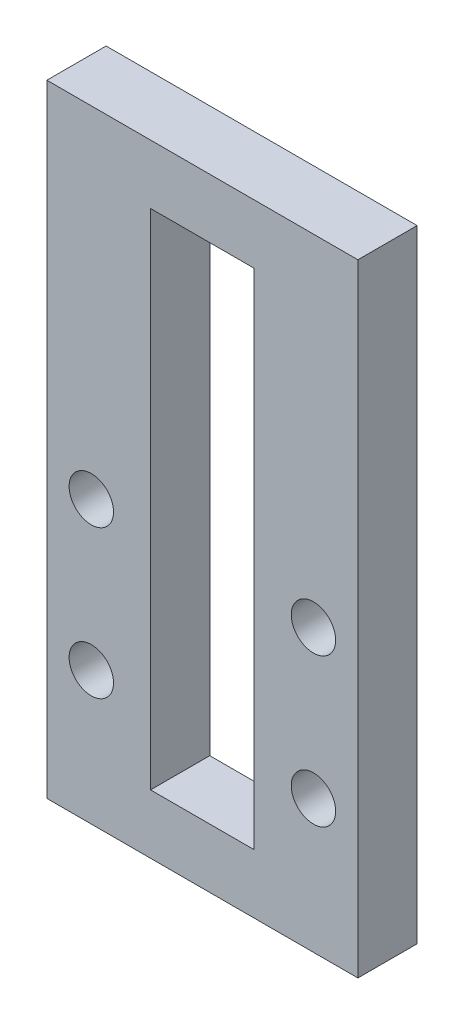
ISO-10303-21;
HEADER;
FILE_DESCRIPTION(('STEP AP214'),'2;1');
FILE_NAME('part.step','',(''),(''),'','','');
FILE_SCHEMA(('AUTOMOTIVE_DESIGN { 1 0 10303 214 1 1 1 1 }'));
ENDSEC;
DATA;
#1=APPLICATION_CONTEXT('core data for automotive mechanical design processes');
#2=APPLICATION_PROTOCOL_DEFINITION('international standard','automotive_design',2000,#1);
#3=PRODUCT_CONTEXT('',#1,'mechanical');
#4=PRODUCT('Part','Part','',(#3));
#5=PRODUCT_RELATED_PRODUCT_CATEGORY('part','',(#4));
#6=PRODUCT_DEFINITION_FORMATION('','',#4);
#7=PRODUCT_DEFINITION_CONTEXT('part definition',#1,'design');
#8=PRODUCT_DEFINITION('design','',#6,#7);
#9=PRODUCT_DEFINITION_SHAPE('','',#8);
#10=(LENGTH_UNIT() NAMED_UNIT(*) SI_UNIT(.MILLI.,.METRE.));
#11=(NAMED_UNIT(*) PLANE_ANGLE_UNIT() SI_UNIT($,.RADIAN.));
#12=(NAMED_UNIT(*) SI_UNIT($,.STERADIAN.) SOLID_ANGLE_UNIT());
#13=UNCERTAINTY_MEASURE_WITH_UNIT(LENGTH_MEASURE(1.E-05),#10,'distance_accuracy_value','');
#14=(GEOMETRIC_REPRESENTATION_CONTEXT(3) GLOBAL_UNCERTAINTY_ASSIGNED_CONTEXT((#13)) GLOBAL_UNIT_ASSIGNED_CONTEXT((#10,
#11,#12)) REPRESENTATION_CONTEXT('',''));
#15=CARTESIAN_POINT('',(0.,0.,0.));
#16=DIRECTION('',(0.,0.,1.));
#17=DIRECTION('',(1.,0.,0.));
#18=AXIS2_PLACEMENT_3D('',#15,#16,#17);
#19=CARTESIAN_POINT('',(0.,0.,4.));
#20=DIRECTION('',(0.,0.,1.));
#21=DIRECTION('',(1.,0.,0.));
#22=AXIS2_PLACEMENT_3D('',#19,#20,#21);
#23=PLANE('',#22);
#24=DIRECTION('',(0.,-1.,0.));
#25=VECTOR('',#24,1.);
#26=CARTESIAN_POINT('',(-3.5,24.,4.));
#27=LINE('',#26,#25);
#28=CARTESIAN_POINT('',(-3.5,24.,4.));
#29=VERTEX_POINT('',#28);
#30=CARTESIAN_POINT('',(-3.5,-10.,4.));
#31=VERTEX_POINT('',#30);
#32=EDGE_CURVE('E51',#29,#31,#27,.T.);
#33=ORIENTED_EDGE('',*,*,#32,.F.);
#34=DIRECTION('',(-1.,0.,0.));
#35=VECTOR('',#34,1.);
#36=CARTESIAN_POINT('',(-3.5,24.,4.));
#37=LINE('',#36,#35);
#38=CARTESIAN_POINT('',(3.5,24.,4.));
#39=VERTEX_POINT('',#38);
#40=EDGE_CURVE('E119',#39,#29,#37,.T.);
#41=ORIENTED_EDGE('',*,*,#40,.F.);
#42=DIRECTION('',(0.,1.,0.));
#43=VECTOR('',#42,1.);
#44=CARTESIAN_POINT('',(3.5,24.,4.));
#45=LINE('',#44,#43);
#46=CARTESIAN_POINT('',(3.5,-10.,4.));
#47=VERTEX_POINT('',#46);
#48=EDGE_CURVE('E122',#47,#39,#45,.T.);
#49=ORIENTED_EDGE('',*,*,#48,.F.);
#50=DIRECTION('',(1.,0.,0.));
#51=VECTOR('',#50,1.);
#52=CARTESIAN_POINT('',(-3.5,-10.,4.));
#53=LINE('',#52,#51);
#54=EDGE_CURVE('E128',#31,#47,#53,.T.);
#55=ORIENTED_EDGE('',*,*,#54,.F.);
#56=EDGE_LOOP('',(#33,#41,#49,#55));
#57=FACE_BOUND('',#56,.T.);
#58=DIRECTION('',(0.,1.,0.));
#59=VECTOR('',#58,1.);
#60=CARTESIAN_POINT('',(10.5,-14.,4.));
#61=LINE('',#60,#59);
#62=CARTESIAN_POINT('',(10.5,-14.,4.));
#63=VERTEX_POINT('',#62);
#64=CARTESIAN_POINT('',(10.5,28.,4.));
#65=VERTEX_POINT('',#64);
#66=EDGE_CURVE('E181',#63,#65,#61,.T.);
#67=ORIENTED_EDGE('',*,*,#66,.T.);
#68=DIRECTION('',(-1.,0.,0.));
#69=VECTOR('',#68,1.);
#70=CARTESIAN_POINT('',(-10.5,28.,4.));
#71=LINE('',#70,#69);
#72=CARTESIAN_POINT('',(-10.5,28.,4.));
#73=VERTEX_POINT('',#72);
#74=EDGE_CURVE('E134',#65,#73,#71,.T.);
#75=ORIENTED_EDGE('',*,*,#74,.T.);
#76=DIRECTION('',(0.,-1.,0.));
#77=VECTOR('',#76,1.);
#78=CARTESIAN_POINT('',(-10.5,14.,4.));
#79=LINE('',#78,#77);
#80=CARTESIAN_POINT('',(-10.5,-14.,4.));
#81=VERTEX_POINT('',#80);
#82=EDGE_CURVE('E175',#73,#81,#79,.T.);
#83=ORIENTED_EDGE('',*,*,#82,.T.);
#84=DIRECTION('',(1.,0.,0.));
#85=VECTOR('',#84,1.);
#86=CARTESIAN_POINT('',(-10.5,-14.,4.));
#87=LINE('',#86,#85);
#88=EDGE_CURVE('E178',#81,#63,#87,.T.);
#89=ORIENTED_EDGE('',*,*,#88,.T.);
#90=EDGE_LOOP('',(#67,#75,#83,#89));
#91=FACE_BOUND('',#90,.T.);
#92=CARTESIAN_POINT('',(-7.5,-5.,4.));
#93=DIRECTION('',(0.,0.,1.));
#94=DIRECTION('',(1.,0.,0.));
#95=AXIS2_PLACEMENT_3D('',#92,#93,#94);
#96=CIRCLE('',#95,1.5);
#97=CARTESIAN_POINT('',(-6.,-5.,4.));
#98=VERTEX_POINT('',#97);
#99=EDGE_CURVE('E157',#98,#98,#96,.T.);
#100=ORIENTED_EDGE('',*,*,#99,.F.);
#101=EDGE_LOOP('',(#100));
#102=FACE_BOUND('',#101,.T.);
#103=CARTESIAN_POINT('',(-7.5,5.,4.));
#104=DIRECTION('',(0.,0.,1.));
#105=DIRECTION('',(1.,0.,0.));
#106=AXIS2_PLACEMENT_3D('',#103,#104,#105);
#107=CIRCLE('',#106,1.5);
#108=CARTESIAN_POINT('',(-6.,5.,4.));
#109=VERTEX_POINT('',#108);
#110=EDGE_CURVE('E169',#109,#109,#107,.T.);
#111=ORIENTED_EDGE('',*,*,#110,.F.);
#112=EDGE_LOOP('',(#111));
#113=FACE_BOUND('',#112,.T.);
#114=CARTESIAN_POINT('',(7.5,5.,4.));
#115=DIRECTION('',(0.,0.,1.));
#116=DIRECTION('',(1.,0.,0.));
#117=AXIS2_PLACEMENT_3D('',#114,#115,#116);
#118=CIRCLE('',#117,1.5);
#119=CARTESIAN_POINT('',(9.,5.,4.));
#120=VERTEX_POINT('',#119);
#121=EDGE_CURVE('E163',#120,#120,#118,.T.);
#122=ORIENTED_EDGE('',*,*,#121,.F.);
#123=EDGE_LOOP('',(#122));
#124=FACE_BOUND('',#123,.T.);
#125=CARTESIAN_POINT('',(7.5,-5.,4.));
#126=DIRECTION('',(0.,0.,1.));
#127=DIRECTION('',(1.,0.,0.));
#128=AXIS2_PLACEMENT_3D('',#125,#126,#127);
#129=CIRCLE('',#128,1.5);
#130=CARTESIAN_POINT('',(9.,-5.,4.));
#131=VERTEX_POINT('',#130);
#132=EDGE_CURVE('E151',#131,#131,#129,.T.);
#133=ORIENTED_EDGE('',*,*,#132,.F.);
#134=EDGE_LOOP('',(#133));
#135=FACE_BOUND('',#134,.T.);
#136=ADVANCED_FACE('F36',(#57,#91,#102,#113,#124,#135),#23,.T.);
#137=CARTESIAN_POINT('',(0.,0.,0.));
#138=DIRECTION('',(0.,0.,1.));
#139=DIRECTION('',(1.,0.,0.));
#140=AXIS2_PLACEMENT_3D('',#137,#138,#139);
#141=PLANE('',#140);
#142=DIRECTION('',(-1.,0.,0.));
#143=VECTOR('',#142,1.);
#144=CARTESIAN_POINT('',(-3.5,24.,0.));
#145=LINE('',#144,#143);
#146=CARTESIAN_POINT('',(3.5,24.,0.));
#147=VERTEX_POINT('',#146);
#148=CARTESIAN_POINT('',(-3.5,24.,0.));
#149=VERTEX_POINT('',#148);
#150=EDGE_CURVE('E109',#147,#149,#145,.T.);
#151=ORIENTED_EDGE('',*,*,#150,.T.);
#152=DIRECTION('',(0.,-1.,0.));
#153=VECTOR('',#152,1.);
#154=CARTESIAN_POINT('',(-3.5,24.,0.));
#155=LINE('',#154,#153);
#156=CARTESIAN_POINT('',(-3.5,-10.,0.));
#157=VERTEX_POINT('',#156);
#158=EDGE_CURVE('E103',#149,#157,#155,.T.);
#159=ORIENTED_EDGE('',*,*,#158,.T.);
#160=DIRECTION('',(1.,0.,0.));
#161=VECTOR('',#160,1.);
#162=CARTESIAN_POINT('',(-3.5,-10.,0.));
#163=LINE('',#162,#161);
#164=CARTESIAN_POINT('',(3.5,-10.,0.));
#165=VERTEX_POINT('',#164);
#166=EDGE_CURVE('E112',#157,#165,#163,.T.);
#167=ORIENTED_EDGE('',*,*,#166,.T.);
#168=DIRECTION('',(0.,1.,0.));
#169=VECTOR('',#168,1.);
#170=CARTESIAN_POINT('',(3.5,24.,0.));
#171=LINE('',#170,#169);
#172=EDGE_CURVE('E59',#165,#147,#171,.T.);
#173=ORIENTED_EDGE('',*,*,#172,.T.);
#174=EDGE_LOOP('',(#151,#159,#167,#173));
#175=FACE_BOUND('',#174,.T.);
#176=DIRECTION('',(0.,-1.,0.));
#177=VECTOR('',#176,1.);
#178=CARTESIAN_POINT('',(-10.5,14.,0.));
#179=LINE('',#178,#177);
#180=CARTESIAN_POINT('',(-10.5,28.,0.));
#181=VERTEX_POINT('',#180);
#182=CARTESIAN_POINT('',(-10.5,-14.,0.));
#183=VERTEX_POINT('',#182);
#184=EDGE_CURVE('E172',#181,#183,#179,.T.);
#185=ORIENTED_EDGE('',*,*,#184,.F.);
#186=DIRECTION('',(1.,0.,0.));
#187=VECTOR('',#186,1.);
#188=CARTESIAN_POINT('',(-10.5,28.,0.));
#189=LINE('',#188,#187);
#190=CARTESIAN_POINT('',(10.5,28.,0.));
#191=VERTEX_POINT('',#190);
#192=EDGE_CURVE('E138',#181,#191,#189,.T.);
#193=ORIENTED_EDGE('',*,*,#192,.T.);
#194=DIRECTION('',(0.,1.,0.));
#195=VECTOR('',#194,1.);
#196=CARTESIAN_POINT('',(10.5,-14.,0.));
#197=LINE('',#196,#195);
#198=CARTESIAN_POINT('',(10.5,-14.,0.));
#199=VERTEX_POINT('',#198);
#200=EDGE_CURVE('E179',#199,#191,#197,.T.);
#201=ORIENTED_EDGE('',*,*,#200,.F.);
#202=DIRECTION('',(1.,0.,0.));
#203=VECTOR('',#202,1.);
#204=CARTESIAN_POINT('',(-10.5,-14.,0.));
#205=LINE('',#204,#203);
#206=EDGE_CURVE('E185',#183,#199,#205,.T.);
#207=ORIENTED_EDGE('',*,*,#206,.F.);
#208=EDGE_LOOP('',(#185,#193,#201,#207));
#209=FACE_BOUND('',#208,.T.);
#210=CARTESIAN_POINT('',(-7.5,5.,0.));
#211=DIRECTION('',(0.,0.,1.));
#212=DIRECTION('',(1.,0.,0.));
#213=AXIS2_PLACEMENT_3D('',#210,#211,#212);
#214=CIRCLE('',#213,1.5);
#215=CARTESIAN_POINT('',(-6.,5.,0.));
#216=VERTEX_POINT('',#215);
#217=EDGE_CURVE('E166',#216,#216,#214,.T.);
#218=ORIENTED_EDGE('',*,*,#217,.T.);
#219=EDGE_LOOP('',(#218));
#220=FACE_BOUND('',#219,.T.);
#221=CARTESIAN_POINT('',(7.5,5.,0.));
#222=DIRECTION('',(0.,0.,1.));
#223=DIRECTION('',(1.,0.,0.));
#224=AXIS2_PLACEMENT_3D('',#221,#222,#223);
#225=CIRCLE('',#224,1.5);
#226=CARTESIAN_POINT('',(9.,5.,0.));
#227=VERTEX_POINT('',#226);
#228=EDGE_CURVE('E160',#227,#227,#225,.T.);
#229=ORIENTED_EDGE('',*,*,#228,.T.);
#230=EDGE_LOOP('',(#229));
#231=FACE_BOUND('',#230,.T.);
#232=CARTESIAN_POINT('',(-7.5,-5.,0.));
#233=DIRECTION('',(0.,0.,1.));
#234=DIRECTION('',(1.,0.,0.));
#235=AXIS2_PLACEMENT_3D('',#232,#233,#234);
#236=CIRCLE('',#235,1.5);
#237=CARTESIAN_POINT('',(-6.,-5.,0.));
#238=VERTEX_POINT('',#237);
#239=EDGE_CURVE('E154',#238,#238,#236,.T.);
#240=ORIENTED_EDGE('',*,*,#239,.T.);
#241=EDGE_LOOP('',(#240));
#242=FACE_BOUND('',#241,.T.);
#243=CARTESIAN_POINT('',(7.5,-5.,0.));
#244=DIRECTION('',(0.,0.,1.));
#245=DIRECTION('',(1.,0.,0.));
#246=AXIS2_PLACEMENT_3D('',#243,#244,#245);
#247=CIRCLE('',#246,1.5);
#248=CARTESIAN_POINT('',(9.,-5.,0.));
#249=VERTEX_POINT('',#248);
#250=EDGE_CURVE('E141',#249,#249,#247,.T.);
#251=ORIENTED_EDGE('',*,*,#250,.T.);
#252=EDGE_LOOP('',(#251));
#253=FACE_BOUND('',#252,.T.);
#254=ADVANCED_FACE('F116',(#175,#209,#220,#231,#242,#253),#141,.F.);
#255=CARTESIAN_POINT('',(-10.5,14.,4.));
#256=DIRECTION('',(1.,0.,0.));
#257=DIRECTION('',(0.,0.,-1.));
#258=AXIS2_PLACEMENT_3D('',#255,#256,#257);
#259=PLANE('',#258);
#260=ORIENTED_EDGE('',*,*,#184,.T.);
#261=DIRECTION('',(0.,0.,-1.));
#262=VECTOR('',#261,1.);
#263=CARTESIAN_POINT('',(-10.5,-14.,4.));
#264=LINE('',#263,#262);
#265=EDGE_CURVE('E11',#81,#183,#264,.T.);
#266=ORIENTED_EDGE('',*,*,#265,.F.);
#267=ORIENTED_EDGE('',*,*,#82,.F.);
#268=DIRECTION('',(0.,0.,1.));
#269=VECTOR('',#268,1.);
#270=CARTESIAN_POINT('',(-10.5,28.,-25.2388589282479));
#271=LINE('',#270,#269);
#272=EDGE_CURVE('E142',#181,#73,#271,.T.);
#273=ORIENTED_EDGE('',*,*,#272,.F.);
#274=EDGE_LOOP('',(#260,#266,#267,#273));
#275=FACE_BOUND('',#274,.T.);
#276=ADVANCED_FACE('F38',(#275),#259,.F.);
#277=CARTESIAN_POINT('',(-10.5,-14.,4.));
#278=DIRECTION('',(0.,1.,0.));
#279=DIRECTION('',(0.,0.,1.));
#280=AXIS2_PLACEMENT_3D('',#277,#278,#279);
#281=PLANE('',#280);
#282=ORIENTED_EDGE('',*,*,#206,.T.);
#283=DIRECTION('',(0.,0.,-1.));
#284=VECTOR('',#283,1.);
#285=CARTESIAN_POINT('',(10.5,-14.,4.));
#286=LINE('',#285,#284);
#287=EDGE_CURVE('E44',#63,#199,#286,.T.);
#288=ORIENTED_EDGE('',*,*,#287,.F.);
#289=ORIENTED_EDGE('',*,*,#88,.F.);
#290=ORIENTED_EDGE('',*,*,#265,.T.);
#291=EDGE_LOOP('',(#282,#288,#289,#290));
#292=FACE_BOUND('',#291,.T.);
#293=ADVANCED_FACE('F204',(#292),#281,.F.);
#294=CARTESIAN_POINT('',(10.5,14.,4.));
#295=DIRECTION('',(-1.,0.,0.));
#296=DIRECTION('',(0.,0.,1.));
#297=AXIS2_PLACEMENT_3D('',#294,#295,#296);
#298=PLANE('',#297);
#299=ORIENTED_EDGE('',*,*,#200,.T.);
#300=DIRECTION('',(0.,0.,1.));
#301=VECTOR('',#300,1.);
#302=CARTESIAN_POINT('',(10.5,28.,-25.2388589282479));
#303=LINE('',#302,#301);
#304=EDGE_CURVE('E145',#191,#65,#303,.T.);
#305=ORIENTED_EDGE('',*,*,#304,.T.);
#306=ORIENTED_EDGE('',*,*,#66,.F.);
#307=ORIENTED_EDGE('',*,*,#287,.T.);
#308=EDGE_LOOP('',(#299,#305,#306,#307));
#309=FACE_BOUND('',#308,.T.);
#310=ADVANCED_FACE('F192',(#309),#298,.F.);
#311=CARTESIAN_POINT('',(-7.5,5.,4.));
#312=DIRECTION('',(0.,0.,-1.));
#313=DIRECTION('',(-1.,0.,0.));
#314=AXIS2_PLACEMENT_3D('',#311,#312,#313);
#315=CYLINDRICAL_SURFACE('',#314,1.5);
#316=ORIENTED_EDGE('',*,*,#110,.T.);
#317=EDGE_LOOP('',(#316));
#318=FACE_BOUND('',#317,.T.);
#319=ORIENTED_EDGE('',*,*,#217,.F.);
#320=EDGE_LOOP('',(#319));
#321=FACE_BOUND('',#320,.T.);
#322=ADVANCED_FACE('F218',(#318,#321),#315,.F.);
#323=CARTESIAN_POINT('',(7.5,5.,4.));
#324=DIRECTION('',(0.,0.,-1.));
#325=DIRECTION('',(-1.,0.,0.));
#326=AXIS2_PLACEMENT_3D('',#323,#324,#325);
#327=CYLINDRICAL_SURFACE('',#326,1.5);
#328=ORIENTED_EDGE('',*,*,#121,.T.);
#329=EDGE_LOOP('',(#328));
#330=FACE_BOUND('',#329,.T.);
#331=ORIENTED_EDGE('',*,*,#228,.F.);
#332=EDGE_LOOP('',(#331));
#333=FACE_BOUND('',#332,.T.);
#334=ADVANCED_FACE('F225',(#330,#333),#327,.F.);
#335=CARTESIAN_POINT('',(-7.5,-5.,4.));
#336=DIRECTION('',(0.,0.,-1.));
#337=DIRECTION('',(-1.,0.,0.));
#338=AXIS2_PLACEMENT_3D('',#335,#336,#337);
#339=CYLINDRICAL_SURFACE('',#338,1.5);
#340=ORIENTED_EDGE('',*,*,#99,.T.);
#341=EDGE_LOOP('',(#340));
#342=FACE_BOUND('',#341,.T.);
#343=ORIENTED_EDGE('',*,*,#239,.F.);
#344=EDGE_LOOP('',(#343));
#345=FACE_BOUND('',#344,.T.);
#346=ADVANCED_FACE('F230',(#342,#345),#339,.F.);
#347=CARTESIAN_POINT('',(7.5,-5.,4.));
#348=DIRECTION('',(0.,0.,-1.));
#349=DIRECTION('',(-1.,0.,0.));
#350=AXIS2_PLACEMENT_3D('',#347,#348,#349);
#351=CYLINDRICAL_SURFACE('',#350,1.5);
#352=ORIENTED_EDGE('',*,*,#132,.T.);
#353=EDGE_LOOP('',(#352));
#354=FACE_BOUND('',#353,.T.);
#355=ORIENTED_EDGE('',*,*,#250,.F.);
#356=EDGE_LOOP('',(#355));
#357=FACE_BOUND('',#356,.T.);
#358=ADVANCED_FACE('F242',(#354,#357),#351,.F.);
#359=CARTESIAN_POINT('',(-10.5,28.,-25.2388589282479));
#360=DIRECTION('',(0.,1.,0.));
#361=DIRECTION('',(0.,0.,1.));
#362=AXIS2_PLACEMENT_3D('',#359,#360,#361);
#363=PLANE('',#362);
#364=ORIENTED_EDGE('',*,*,#192,.F.);
#365=ORIENTED_EDGE('',*,*,#272,.T.);
#366=ORIENTED_EDGE('',*,*,#74,.F.);
#367=ORIENTED_EDGE('',*,*,#304,.F.);
#368=EDGE_LOOP('',(#364,#365,#366,#367));
#369=FACE_BOUND('',#368,.T.);
#370=ADVANCED_FACE('F200',(#369),#363,.T.);
#371=CARTESIAN_POINT('',(-3.5,24.,0.));
#372=DIRECTION('',(-1.,0.,0.));
#373=DIRECTION('',(0.,-1.,0.));
#374=AXIS2_PLACEMENT_3D('',#371,#372,#373);
#375=PLANE('',#374);
#376=ORIENTED_EDGE('',*,*,#32,.T.);
#377=DIRECTION('',(0.,0.,1.));
#378=VECTOR('',#377,1.);
#379=CARTESIAN_POINT('',(-3.5,-10.,0.));
#380=LINE('',#379,#378);
#381=EDGE_CURVE('E99',#157,#31,#380,.T.);
#382=ORIENTED_EDGE('',*,*,#381,.F.);
#383=ORIENTED_EDGE('',*,*,#158,.F.);
#384=DIRECTION('',(0.,0.,1.));
#385=VECTOR('',#384,1.);
#386=CARTESIAN_POINT('',(-3.5,24.,0.));
#387=LINE('',#386,#385);
#388=EDGE_CURVE('E132',#149,#29,#387,.T.);
#389=ORIENTED_EDGE('',*,*,#388,.T.);
#390=EDGE_LOOP('',(#376,#382,#383,#389));
#391=FACE_BOUND('',#390,.T.);
#392=ADVANCED_FACE('F101',(#391),#375,.F.);
#393=CARTESIAN_POINT('',(-3.5,24.,0.));
#394=DIRECTION('',(0.,1.,0.));
#395=DIRECTION('',(0.,0.,1.));
#396=AXIS2_PLACEMENT_3D('',#393,#394,#395);
#397=PLANE('',#396);
#398=ORIENTED_EDGE('',*,*,#40,.T.);
#399=ORIENTED_EDGE('',*,*,#388,.F.);
#400=ORIENTED_EDGE('',*,*,#150,.F.);
#401=DIRECTION('',(0.,0.,1.));
#402=VECTOR('',#401,1.);
#403=CARTESIAN_POINT('',(3.5,24.,0.));
#404=LINE('',#403,#402);
#405=EDGE_CURVE('E135',#147,#39,#404,.T.);
#406=ORIENTED_EDGE('',*,*,#405,.T.);
#407=EDGE_LOOP('',(#398,#399,#400,#406));
#408=FACE_BOUND('',#407,.T.);
#409=ADVANCED_FACE('F256',(#408),#397,.F.);
#410=CARTESIAN_POINT('',(3.5,24.,0.));
#411=DIRECTION('',(1.,0.,0.));
#412=DIRECTION('',(0.,1.,0.));
#413=AXIS2_PLACEMENT_3D('',#410,#411,#412);
#414=PLANE('',#413);
#415=ORIENTED_EDGE('',*,*,#48,.T.);
#416=ORIENTED_EDGE('',*,*,#405,.F.);
#417=ORIENTED_EDGE('',*,*,#172,.F.);
#418=DIRECTION('',(0.,0.,1.));
#419=VECTOR('',#418,1.);
#420=CARTESIAN_POINT('',(3.5,-10.,0.));
#421=LINE('',#420,#419);
#422=EDGE_CURVE('E108',#165,#47,#421,.T.);
#423=ORIENTED_EDGE('',*,*,#422,.T.);
#424=EDGE_LOOP('',(#415,#416,#417,#423));
#425=FACE_BOUND('',#424,.T.);
#426=ADVANCED_FACE('F259',(#425),#414,.F.);
#427=CARTESIAN_POINT('',(-3.5,-10.,0.));
#428=DIRECTION('',(0.,-1.,0.));
#429=DIRECTION('',(0.,0.,-1.));
#430=AXIS2_PLACEMENT_3D('',#427,#428,#429);
#431=PLANE('',#430);
#432=ORIENTED_EDGE('',*,*,#54,.T.);
#433=ORIENTED_EDGE('',*,*,#422,.F.);
#434=ORIENTED_EDGE('',*,*,#166,.F.);
#435=ORIENTED_EDGE('',*,*,#381,.T.);
#436=EDGE_LOOP('',(#432,#433,#434,#435));
#437=FACE_BOUND('',#436,.T.);
#438=ADVANCED_FACE('F113',(#437),#431,.F.);
#439=CLOSED_SHELL('',(#136,#254,#276,#293,#310,#322,#334,#346,#358,#370,#392,#409,#426,#438));
#440=MANIFOLD_SOLID_BREP('B2',#439);
#441=ADVANCED_BREP_SHAPE_REPRESENTATION('',(#18,#440),#14);
#442=SHAPE_DEFINITION_REPRESENTATION(#9,#441);
ENDSEC;
END-ISO-10303-21;
